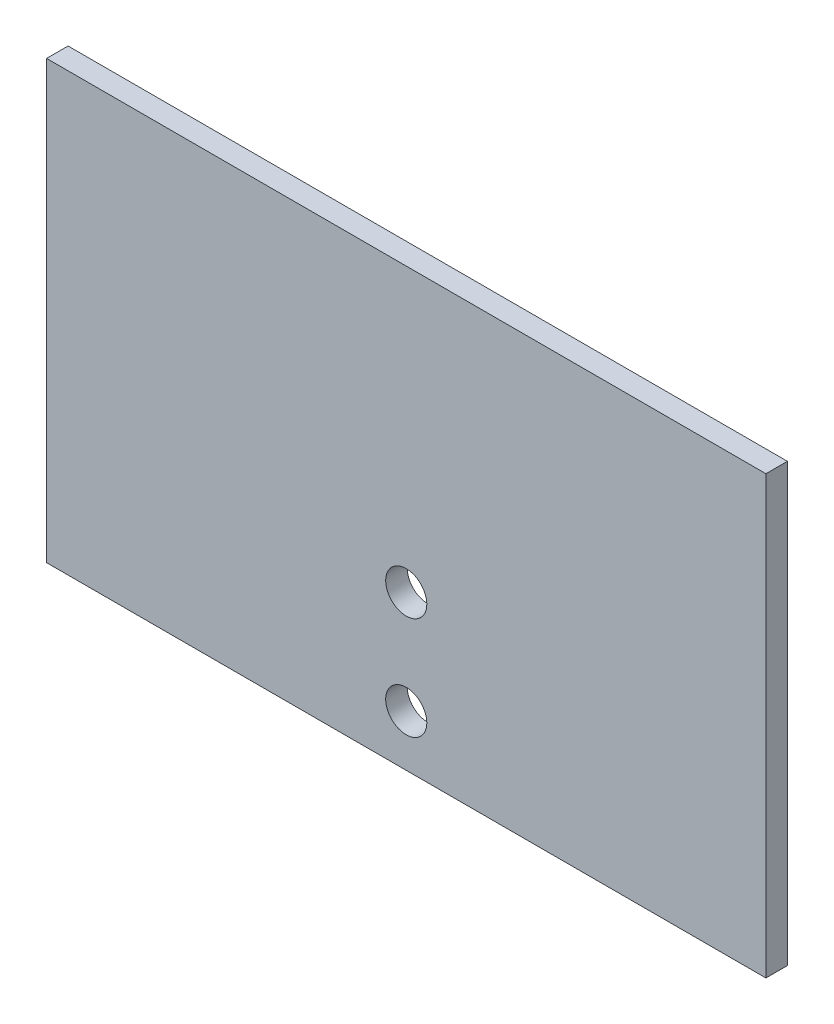
ISO-10303-21;
HEADER;
FILE_DESCRIPTION(('STEP AP214'),'2;1');
FILE_NAME('part.step','',(''),(''),'','','');
FILE_SCHEMA(('AUTOMOTIVE_DESIGN { 1 0 10303 214 1 1 1 1 }'));
ENDSEC;
DATA;
#1=APPLICATION_CONTEXT('core data for automotive mechanical design processes');
#2=APPLICATION_PROTOCOL_DEFINITION('international standard','automotive_design',2000,#1);
#3=PRODUCT_CONTEXT('',#1,'mechanical');
#4=PRODUCT('Part','Part','',(#3));
#5=PRODUCT_RELATED_PRODUCT_CATEGORY('part','',(#4));
#6=PRODUCT_DEFINITION_FORMATION('','',#4);
#7=PRODUCT_DEFINITION_CONTEXT('part definition',#1,'design');
#8=PRODUCT_DEFINITION('design','',#6,#7);
#9=PRODUCT_DEFINITION_SHAPE('','',#8);
#10=(LENGTH_UNIT() NAMED_UNIT(*) SI_UNIT(.MILLI.,.METRE.));
#11=(NAMED_UNIT(*) PLANE_ANGLE_UNIT() SI_UNIT($,.RADIAN.));
#12=(NAMED_UNIT(*) SI_UNIT($,.STERADIAN.) SOLID_ANGLE_UNIT());
#13=UNCERTAINTY_MEASURE_WITH_UNIT(LENGTH_MEASURE(1.E-05),#10,'distance_accuracy_value','');
#14=(GEOMETRIC_REPRESENTATION_CONTEXT(3) GLOBAL_UNCERTAINTY_ASSIGNED_CONTEXT((#13)) GLOBAL_UNIT_ASSIGNED_CONTEXT((#10,
#11,#12)) REPRESENTATION_CONTEXT('',''));
#15=CARTESIAN_POINT('',(0.,0.,0.));
#16=DIRECTION('',(0.,0.,1.));
#17=DIRECTION('',(1.,0.,0.));
#18=AXIS2_PLACEMENT_3D('',#15,#16,#17);
#19=CARTESIAN_POINT('',(0.,0.,2.65684));
#20=DIRECTION('',(1.,0.,0.));
#21=DIRECTION('',(0.,0.,-1.));
#22=AXIS2_PLACEMENT_3D('',#19,#20,#21);
#23=PLANE('',#22);
#24=DIRECTION('',(0.,-1.,0.));
#25=VECTOR('',#24,1.);
#26=CARTESIAN_POINT('',(0.,0.,0.));
#27=LINE('',#26,#25);
#28=CARTESIAN_POINT('',(0.,53.975,0.));
#29=VERTEX_POINT('',#28);
#30=CARTESIAN_POINT('',(0.,0.,0.));
#31=VERTEX_POINT('',#30);
#32=EDGE_CURVE('E97',#29,#31,#27,.T.);
#33=ORIENTED_EDGE('',*,*,#32,.T.);
#34=DIRECTION('',(0.,0.,-1.));
#35=VECTOR('',#34,1.);
#36=CARTESIAN_POINT('',(0.,0.,2.65684));
#37=LINE('',#36,#35);
#38=CARTESIAN_POINT('',(0.,0.,2.65684));
#39=VERTEX_POINT('',#38);
#40=EDGE_CURVE('E11',#39,#31,#37,.T.);
#41=ORIENTED_EDGE('',*,*,#40,.F.);
#42=DIRECTION('',(0.,-1.,0.));
#43=VECTOR('',#42,1.);
#44=CARTESIAN_POINT('',(0.,0.,2.65684));
#45=LINE('',#44,#43);
#46=CARTESIAN_POINT('',(0.,53.975,2.65684));
#47=VERTEX_POINT('',#46);
#48=EDGE_CURVE('E85',#47,#39,#45,.T.);
#49=ORIENTED_EDGE('',*,*,#48,.F.);
#50=DIRECTION('',(0.,0.,-1.));
#51=VECTOR('',#50,1.);
#52=CARTESIAN_POINT('',(0.,53.975,2.65684));
#53=LINE('',#52,#51);
#54=EDGE_CURVE('E93',#47,#29,#53,.T.);
#55=ORIENTED_EDGE('',*,*,#54,.T.);
#56=EDGE_LOOP('',(#33,#41,#49,#55));
#57=FACE_BOUND('',#56,.T.);
#58=ADVANCED_FACE('F34',(#57),#23,.F.);
#59=CARTESIAN_POINT('',(0.,0.,2.65684));
#60=DIRECTION('',(0.,1.,0.));
#61=DIRECTION('',(0.,0.,1.));
#62=AXIS2_PLACEMENT_3D('',#59,#60,#61);
#63=PLANE('',#62);
#64=DIRECTION('',(1.,0.,0.));
#65=VECTOR('',#64,1.);
#66=CARTESIAN_POINT('',(0.,0.,0.));
#67=LINE('',#66,#65);
#68=CARTESIAN_POINT('',(88.9,0.,0.));
#69=VERTEX_POINT('',#68);
#70=EDGE_CURVE('E89',#31,#69,#67,.T.);
#71=ORIENTED_EDGE('',*,*,#70,.T.);
#72=DIRECTION('',(0.,0.,-1.));
#73=VECTOR('',#72,1.);
#74=CARTESIAN_POINT('',(88.9,0.,2.65684));
#75=LINE('',#74,#73);
#76=CARTESIAN_POINT('',(88.9,0.,2.65684));
#77=VERTEX_POINT('',#76);
#78=EDGE_CURVE('E42',#77,#69,#75,.T.);
#79=ORIENTED_EDGE('',*,*,#78,.F.);
#80=DIRECTION('',(1.,0.,0.));
#81=VECTOR('',#80,1.);
#82=CARTESIAN_POINT('',(0.,0.,2.65684));
#83=LINE('',#82,#81);
#84=EDGE_CURVE('E80',#39,#77,#83,.T.);
#85=ORIENTED_EDGE('',*,*,#84,.F.);
#86=ORIENTED_EDGE('',*,*,#40,.T.);
#87=EDGE_LOOP('',(#71,#79,#85,#86));
#88=FACE_BOUND('',#87,.T.);
#89=ADVANCED_FACE('F88',(#88),#63,.F.);
#90=CARTESIAN_POINT('',(88.9,0.,2.65684));
#91=DIRECTION('',(-1.,0.,0.));
#92=DIRECTION('',(0.,0.,1.));
#93=AXIS2_PLACEMENT_3D('',#90,#91,#92);
#94=PLANE('',#93);
#95=DIRECTION('',(0.,1.,0.));
#96=VECTOR('',#95,1.);
#97=CARTESIAN_POINT('',(88.9,0.,0.));
#98=LINE('',#97,#96);
#99=CARTESIAN_POINT('',(88.9,53.975,0.));
#100=VERTEX_POINT('',#99);
#101=EDGE_CURVE('E67',#69,#100,#98,.T.);
#102=ORIENTED_EDGE('',*,*,#101,.T.);
#103=DIRECTION('',(0.,0.,-1.));
#104=VECTOR('',#103,1.);
#105=CARTESIAN_POINT('',(88.9,53.975,2.65684));
#106=LINE('',#105,#104);
#107=CARTESIAN_POINT('',(88.9,53.975,2.65684));
#108=VERTEX_POINT('',#107);
#109=EDGE_CURVE('E90',#108,#100,#106,.T.);
#110=ORIENTED_EDGE('',*,*,#109,.F.);
#111=DIRECTION('',(0.,1.,0.));
#112=VECTOR('',#111,1.);
#113=CARTESIAN_POINT('',(88.9,0.,2.65684));
#114=LINE('',#113,#112);
#115=EDGE_CURVE('E83',#77,#108,#114,.T.);
#116=ORIENTED_EDGE('',*,*,#115,.F.);
#117=ORIENTED_EDGE('',*,*,#78,.T.);
#118=EDGE_LOOP('',(#102,#110,#116,#117));
#119=FACE_BOUND('',#118,.T.);
#120=ADVANCED_FACE('F91',(#119),#94,.F.);
#121=CARTESIAN_POINT('',(0.,53.975,2.65684));
#122=DIRECTION('',(0.,-1.,0.));
#123=DIRECTION('',(0.,0.,-1.));
#124=AXIS2_PLACEMENT_3D('',#121,#122,#123);
#125=PLANE('',#124);
#126=DIRECTION('',(-1.,0.,0.));
#127=VECTOR('',#126,1.);
#128=CARTESIAN_POINT('',(0.,53.975,0.));
#129=LINE('',#128,#127);
#130=EDGE_CURVE('E73',#100,#29,#129,.T.);
#131=ORIENTED_EDGE('',*,*,#130,.T.);
#132=ORIENTED_EDGE('',*,*,#54,.F.);
#133=DIRECTION('',(-1.,0.,0.));
#134=VECTOR('',#133,1.);
#135=CARTESIAN_POINT('',(0.,53.975,2.65684));
#136=LINE('',#135,#134);
#137=EDGE_CURVE('E50',#108,#47,#136,.T.);
#138=ORIENTED_EDGE('',*,*,#137,.F.);
#139=ORIENTED_EDGE('',*,*,#109,.T.);
#140=EDGE_LOOP('',(#131,#132,#138,#139));
#141=FACE_BOUND('',#140,.T.);
#142=ADVANCED_FACE('F105',(#141),#125,.F.);
#143=CARTESIAN_POINT('',(0.,0.,2.65684));
#144=DIRECTION('',(0.,0.,-1.));
#145=DIRECTION('',(-1.,0.,0.));
#146=AXIS2_PLACEMENT_3D('',#143,#144,#145);
#147=PLANE('',#146);
#148=CARTESIAN_POINT('',(44.45,6.35,2.65684));
#149=DIRECTION('',(0.,0.,1.));
#150=DIRECTION('',(1.,0.,0.));
#151=AXIS2_PLACEMENT_3D('',#148,#149,#150);
#152=CIRCLE('',#151,2.54);
#153=CARTESIAN_POINT('',(46.99,6.35,2.65684));
#154=VERTEX_POINT('',#153);
#155=EDGE_CURVE('E117',#154,#154,#152,.T.);
#156=ORIENTED_EDGE('',*,*,#155,.F.);
#157=EDGE_LOOP('',(#156));
#158=FACE_BOUND('',#157,.T.);
#159=CARTESIAN_POINT('',(44.45,19.05,2.65684));
#160=DIRECTION('',(0.,0.,1.));
#161=DIRECTION('',(1.,0.,0.));
#162=AXIS2_PLACEMENT_3D('',#159,#160,#161);
#163=CIRCLE('',#162,2.54);
#164=CARTESIAN_POINT('',(46.99,19.05,2.65684));
#165=VERTEX_POINT('',#164);
#166=EDGE_CURVE('E111',#165,#165,#163,.T.);
#167=ORIENTED_EDGE('',*,*,#166,.F.);
#168=EDGE_LOOP('',(#167));
#169=FACE_BOUND('',#168,.T.);
#170=ORIENTED_EDGE('',*,*,#48,.T.);
#171=ORIENTED_EDGE('',*,*,#84,.T.);
#172=ORIENTED_EDGE('',*,*,#115,.T.);
#173=ORIENTED_EDGE('',*,*,#137,.T.);
#174=EDGE_LOOP('',(#170,#171,#172,#173));
#175=FACE_BOUND('',#174,.T.);
#176=ADVANCED_FACE('F81',(#158,#169,#175),#147,.F.);
#177=CARTESIAN_POINT('',(0.,0.,0.));
#178=DIRECTION('',(0.,0.,-1.));
#179=DIRECTION('',(-1.,0.,0.));
#180=AXIS2_PLACEMENT_3D('',#177,#178,#179);
#181=PLANE('',#180);
#182=CARTESIAN_POINT('',(44.45,6.35,0.));
#183=DIRECTION('',(0.,0.,1.));
#184=DIRECTION('',(1.,0.,0.));
#185=AXIS2_PLACEMENT_3D('',#182,#183,#184);
#186=CIRCLE('',#185,2.54);
#187=CARTESIAN_POINT('',(46.99,6.35,0.));
#188=VERTEX_POINT('',#187);
#189=EDGE_CURVE('E100',#188,#188,#186,.T.);
#190=ORIENTED_EDGE('',*,*,#189,.T.);
#191=EDGE_LOOP('',(#190));
#192=FACE_BOUND('',#191,.T.);
#193=CARTESIAN_POINT('',(44.45,19.05,0.));
#194=DIRECTION('',(0.,0.,1.));
#195=DIRECTION('',(1.,0.,0.));
#196=AXIS2_PLACEMENT_3D('',#193,#194,#195);
#197=CIRCLE('',#196,2.54);
#198=CARTESIAN_POINT('',(46.99,19.05,0.));
#199=VERTEX_POINT('',#198);
#200=EDGE_CURVE('E114',#199,#199,#197,.T.);
#201=ORIENTED_EDGE('',*,*,#200,.T.);
#202=EDGE_LOOP('',(#201));
#203=FACE_BOUND('',#202,.T.);
#204=ORIENTED_EDGE('',*,*,#32,.F.);
#205=ORIENTED_EDGE('',*,*,#130,.F.);
#206=ORIENTED_EDGE('',*,*,#101,.F.);
#207=ORIENTED_EDGE('',*,*,#70,.F.);
#208=EDGE_LOOP('',(#204,#205,#206,#207));
#209=FACE_BOUND('',#208,.T.);
#210=ADVANCED_FACE('F108',(#192,#203,#209),#181,.T.);
#211=CARTESIAN_POINT('',(44.45,19.05,0.));
#212=DIRECTION('',(0.,0.,1.));
#213=DIRECTION('',(1.,0.,0.));
#214=AXIS2_PLACEMENT_3D('',#211,#212,#213);
#215=CYLINDRICAL_SURFACE('',#214,2.54);
#216=CARTESIAN_POINT('',(46.99,19.05,0.));
#217=CARTESIAN_POINT('',(46.99,19.05,0.0276754166666666));
#218=CARTESIAN_POINT('',(46.99,19.05,0.0553508333333333));
#219=CARTESIAN_POINT('',(46.99,19.05,0.110701666666667));
#220=CARTESIAN_POINT('',(46.99,19.05,0.138377083333333));
#221=CARTESIAN_POINT('',(46.99,19.05,0.193727916666667));
#222=CARTESIAN_POINT('',(46.99,19.05,0.221403333333333));
#223=CARTESIAN_POINT('',(46.99,19.05,0.276754166666667));
#224=CARTESIAN_POINT('',(46.99,19.05,0.304429583333333));
#225=CARTESIAN_POINT('',(46.99,19.05,0.359780416666667));
#226=CARTESIAN_POINT('',(46.99,19.05,0.387455833333333));
#227=CARTESIAN_POINT('',(46.99,19.05,0.442806666666667));
#228=CARTESIAN_POINT('',(46.99,19.05,0.470482083333333));
#229=CARTESIAN_POINT('',(46.99,19.05,0.525832916666666));
#230=CARTESIAN_POINT('',(46.99,19.05,0.553508333333333));
#231=CARTESIAN_POINT('',(46.99,19.05,0.608859166666667));
#232=CARTESIAN_POINT('',(46.99,19.05,0.636534583333333));
#233=CARTESIAN_POINT('',(46.99,19.05,0.691885416666666));
#234=CARTESIAN_POINT('',(46.99,19.05,0.719560833333333));
#235=CARTESIAN_POINT('',(46.99,19.05,0.774911666666667));
#236=CARTESIAN_POINT('',(46.99,19.05,0.802587083333333));
#237=CARTESIAN_POINT('',(46.99,19.05,0.857937916666667));
#238=CARTESIAN_POINT('',(46.99,19.05,0.885613333333333));
#239=CARTESIAN_POINT('',(46.99,19.05,0.940964166666666));
#240=CARTESIAN_POINT('',(46.99,19.05,0.968639583333333));
#241=CARTESIAN_POINT('',(46.99,19.05,1.02399041666667));
#242=CARTESIAN_POINT('',(46.99,19.05,1.05166583333333));
#243=CARTESIAN_POINT('',(46.99,19.05,1.10701666666667));
#244=CARTESIAN_POINT('',(46.99,19.05,1.13469208333333));
#245=CARTESIAN_POINT('',(46.99,19.05,1.19004291666667));
#246=CARTESIAN_POINT('',(46.99,19.05,1.21771833333333));
#247=CARTESIAN_POINT('',(46.99,19.05,1.27306916666667));
#248=CARTESIAN_POINT('',(46.99,19.05,1.30074458333333));
#249=CARTESIAN_POINT('',(46.99,19.05,1.35609541666667));
#250=CARTESIAN_POINT('',(46.99,19.05,1.38377083333333));
#251=CARTESIAN_POINT('',(46.99,19.05,1.43912166666667));
#252=CARTESIAN_POINT('',(46.99,19.05,1.46679708333333));
#253=CARTESIAN_POINT('',(46.99,19.05,1.52214791666667));
#254=CARTESIAN_POINT('',(46.99,19.05,1.54982333333333));
#255=CARTESIAN_POINT('',(46.99,19.05,1.60517416666667));
#256=CARTESIAN_POINT('',(46.99,19.05,1.63284958333333));
#257=CARTESIAN_POINT('',(46.99,19.05,1.68820041666667));
#258=CARTESIAN_POINT('',(46.99,19.05,1.71587583333333));
#259=CARTESIAN_POINT('',(46.99,19.05,1.77122666666667));
#260=CARTESIAN_POINT('',(46.99,19.05,1.79890208333333));
#261=CARTESIAN_POINT('',(46.99,19.05,1.85425291666667));
#262=CARTESIAN_POINT('',(46.99,19.05,1.88192833333333));
#263=CARTESIAN_POINT('',(46.99,19.05,1.93727916666667));
#264=CARTESIAN_POINT('',(46.99,19.05,1.96495458333333));
#265=CARTESIAN_POINT('',(46.99,19.05,2.02030541666667));
#266=CARTESIAN_POINT('',(46.99,19.05,2.04798083333333));
#267=CARTESIAN_POINT('',(46.99,19.05,2.10333166666667));
#268=CARTESIAN_POINT('',(46.99,19.05,2.13100708333333));
#269=CARTESIAN_POINT('',(46.99,19.05,2.18635791666667));
#270=CARTESIAN_POINT('',(46.99,19.05,2.21403333333333));
#271=CARTESIAN_POINT('',(46.99,19.05,2.26938416666667));
#272=CARTESIAN_POINT('',(46.99,19.05,2.29705958333333));
#273=CARTESIAN_POINT('',(46.99,19.05,2.35241041666667));
#274=CARTESIAN_POINT('',(46.99,19.05,2.38008583333333));
#275=CARTESIAN_POINT('',(46.99,19.05,2.43543666666667));
#276=CARTESIAN_POINT('',(46.99,19.05,2.46311208333333));
#277=CARTESIAN_POINT('',(46.99,19.05,2.51846291666667));
#278=CARTESIAN_POINT('',(46.99,19.05,2.54613833333333));
#279=CARTESIAN_POINT('',(46.99,19.05,2.60148916666667));
#280=CARTESIAN_POINT('',(46.99,19.05,2.62916458333333));
#281=CARTESIAN_POINT('',(46.99,19.05,2.65684));
#282=B_SPLINE_CURVE_WITH_KNOTS('',3,(#216,#217,#218,#219,#220,#221,#222,#223,#224,#225,#226,
#227,#228,#229,#230,#231,#232,#233,#234,#235,#236,#237,#238,#239,#240,#241,#242,#243,#244,#245,
#246,#247,#248,#249,#250,#251,#252,#253,#254,#255,#256,#257,#258,#259,#260,#261,#262,#263,#264,
#265,#266,#267,#268,#269,#270,#271,#272,#273,#274,#275,#276,#277,#278,#279,#280,#281),
.UNSPECIFIED.,.F.,.F.,(4,2,2,2,2,2,2,2,2,2,2,2,2,2,2,2,2,2,2,2,2,2,2,2,2,2,2,2,2,2,2,2,4),(0.,
0.08302625,0.1660525,0.24907875,0.332105,0.41513125,0.4981575,0.58118375,0.66421,0.74723625,
0.8302625,0.91328875,0.996315,1.07934125,1.1623675,1.24539375,1.32842,1.41144625,1.4944725,
1.57749875,1.660525,1.74355125,1.8265775,1.90960375,1.99263,2.07565625,2.1586825,2.24170875,
2.324735,2.40776125,2.4907875,2.57381375,2.65684),.UNSPECIFIED.);
#283=EDGE_CURVE('BSEAM128',#199,#165,#282,.T.);
#284=ORIENTED_EDGE('',*,*,#200,.F.);
#285=ORIENTED_EDGE('',*,*,#166,.T.);
#286=ORIENTED_EDGE('',*,*,#283,.T.);
#287=ORIENTED_EDGE('',*,*,#283,.F.);
#288=EDGE_LOOP('',(#284,#286,#285,#287));
#289=FACE_BOUND('',#288,.T.);
#290=ADVANCED_FACE('F128',(#289),#215,.F.);
#291=CARTESIAN_POINT('',(44.45,6.35,0.));
#292=DIRECTION('',(0.,0.,1.));
#293=DIRECTION('',(1.,0.,0.));
#294=AXIS2_PLACEMENT_3D('',#291,#292,#293);
#295=CYLINDRICAL_SURFACE('',#294,2.54);
#296=CARTESIAN_POINT('',(46.99,6.35,0.));
#297=CARTESIAN_POINT('',(46.99,6.35,0.0276754166666666));
#298=CARTESIAN_POINT('',(46.99,6.35,0.0553508333333333));
#299=CARTESIAN_POINT('',(46.99,6.35,0.110701666666667));
#300=CARTESIAN_POINT('',(46.99,6.35,0.138377083333333));
#301=CARTESIAN_POINT('',(46.99,6.35,0.193727916666667));
#302=CARTESIAN_POINT('',(46.99,6.35,0.221403333333333));
#303=CARTESIAN_POINT('',(46.99,6.35,0.276754166666667));
#304=CARTESIAN_POINT('',(46.99,6.35,0.304429583333333));
#305=CARTESIAN_POINT('',(46.99,6.35,0.359780416666667));
#306=CARTESIAN_POINT('',(46.99,6.35,0.387455833333333));
#307=CARTESIAN_POINT('',(46.99,6.35,0.442806666666667));
#308=CARTESIAN_POINT('',(46.99,6.35,0.470482083333333));
#309=CARTESIAN_POINT('',(46.99,6.35,0.525832916666666));
#310=CARTESIAN_POINT('',(46.99,6.35,0.553508333333333));
#311=CARTESIAN_POINT('',(46.99,6.35,0.608859166666667));
#312=CARTESIAN_POINT('',(46.99,6.35,0.636534583333333));
#313=CARTESIAN_POINT('',(46.99,6.35,0.691885416666666));
#314=CARTESIAN_POINT('',(46.99,6.35,0.719560833333333));
#315=CARTESIAN_POINT('',(46.99,6.35,0.774911666666667));
#316=CARTESIAN_POINT('',(46.99,6.35,0.802587083333333));
#317=CARTESIAN_POINT('',(46.99,6.35,0.857937916666667));
#318=CARTESIAN_POINT('',(46.99,6.35,0.885613333333333));
#319=CARTESIAN_POINT('',(46.99,6.35,0.940964166666666));
#320=CARTESIAN_POINT('',(46.99,6.35,0.968639583333333));
#321=CARTESIAN_POINT('',(46.99,6.35,1.02399041666667));
#322=CARTESIAN_POINT('',(46.99,6.35,1.05166583333333));
#323=CARTESIAN_POINT('',(46.99,6.35,1.10701666666667));
#324=CARTESIAN_POINT('',(46.99,6.35,1.13469208333333));
#325=CARTESIAN_POINT('',(46.99,6.35,1.19004291666667));
#326=CARTESIAN_POINT('',(46.99,6.35,1.21771833333333));
#327=CARTESIAN_POINT('',(46.99,6.35,1.27306916666667));
#328=CARTESIAN_POINT('',(46.99,6.35,1.30074458333333));
#329=CARTESIAN_POINT('',(46.99,6.35,1.35609541666667));
#330=CARTESIAN_POINT('',(46.99,6.35,1.38377083333333));
#331=CARTESIAN_POINT('',(46.99,6.35,1.43912166666667));
#332=CARTESIAN_POINT('',(46.99,6.35,1.46679708333333));
#333=CARTESIAN_POINT('',(46.99,6.35,1.52214791666667));
#334=CARTESIAN_POINT('',(46.99,6.35,1.54982333333333));
#335=CARTESIAN_POINT('',(46.99,6.35,1.60517416666667));
#336=CARTESIAN_POINT('',(46.99,6.35,1.63284958333333));
#337=CARTESIAN_POINT('',(46.99,6.35,1.68820041666667));
#338=CARTESIAN_POINT('',(46.99,6.35,1.71587583333333));
#339=CARTESIAN_POINT('',(46.99,6.35,1.77122666666667));
#340=CARTESIAN_POINT('',(46.99,6.35,1.79890208333333));
#341=CARTESIAN_POINT('',(46.99,6.35,1.85425291666667));
#342=CARTESIAN_POINT('',(46.99,6.35,1.88192833333333));
#343=CARTESIAN_POINT('',(46.99,6.35,1.93727916666667));
#344=CARTESIAN_POINT('',(46.99,6.35,1.96495458333333));
#345=CARTESIAN_POINT('',(46.99,6.35,2.02030541666667));
#346=CARTESIAN_POINT('',(46.99,6.35,2.04798083333333));
#347=CARTESIAN_POINT('',(46.99,6.35,2.10333166666667));
#348=CARTESIAN_POINT('',(46.99,6.35,2.13100708333333));
#349=CARTESIAN_POINT('',(46.99,6.35,2.18635791666667));
#350=CARTESIAN_POINT('',(46.99,6.35,2.21403333333333));
#351=CARTESIAN_POINT('',(46.99,6.35,2.26938416666667));
#352=CARTESIAN_POINT('',(46.99,6.35,2.29705958333333));
#353=CARTESIAN_POINT('',(46.99,6.35,2.35241041666667));
#354=CARTESIAN_POINT('',(46.99,6.35,2.38008583333333));
#355=CARTESIAN_POINT('',(46.99,6.35,2.43543666666667));
#356=CARTESIAN_POINT('',(46.99,6.35,2.46311208333333));
#357=CARTESIAN_POINT('',(46.99,6.35,2.51846291666667));
#358=CARTESIAN_POINT('',(46.99,6.35,2.54613833333333));
#359=CARTESIAN_POINT('',(46.99,6.35,2.60148916666667));
#360=CARTESIAN_POINT('',(46.99,6.35,2.62916458333333));
#361=CARTESIAN_POINT('',(46.99,6.35,2.65684));
#362=B_SPLINE_CURVE_WITH_KNOTS('',3,(#296,#297,#298,#299,#300,#301,#302,#303,#304,#305,#306,
#307,#308,#309,#310,#311,#312,#313,#314,#315,#316,#317,#318,#319,#320,#321,#322,#323,#324,#325,
#326,#327,#328,#329,#330,#331,#332,#333,#334,#335,#336,#337,#338,#339,#340,#341,#342,#343,#344,
#345,#346,#347,#348,#349,#350,#351,#352,#353,#354,#355,#356,#357,#358,#359,#360,#361),
.UNSPECIFIED.,.F.,.F.,(4,2,2,2,2,2,2,2,2,2,2,2,2,2,2,2,2,2,2,2,2,2,2,2,2,2,2,2,2,2,2,2,4),(0.,
0.08302625,0.1660525,0.24907875,0.332105,0.41513125,0.4981575,0.58118375,0.66421,0.74723625,
0.8302625,0.91328875,0.996315,1.07934125,1.1623675,1.24539375,1.32842,1.41144625,1.4944725,
1.57749875,1.660525,1.74355125,1.8265775,1.90960375,1.99263,2.07565625,2.1586825,2.24170875,
2.324735,2.40776125,2.4907875,2.57381375,2.65684),.UNSPECIFIED.);
#363=EDGE_CURVE('BSEAM125',#188,#154,#362,.T.);
#364=ORIENTED_EDGE('',*,*,#189,.F.);
#365=ORIENTED_EDGE('',*,*,#155,.T.);
#366=ORIENTED_EDGE('',*,*,#363,.T.);
#367=ORIENTED_EDGE('',*,*,#363,.F.);
#368=EDGE_LOOP('',(#364,#366,#365,#367));
#369=FACE_BOUND('',#368,.T.);
#370=ADVANCED_FACE('F125',(#369),#295,.F.);
#371=CLOSED_SHELL('',(#58,#89,#120,#142,#176,#210,#290,#370));
#372=MANIFOLD_SOLID_BREP('B2',#371);
#373=ADVANCED_BREP_SHAPE_REPRESENTATION('',(#18,#372),#14);
#374=SHAPE_DEFINITION_REPRESENTATION(#9,#373);
ENDSEC;
END-ISO-10303-21;
